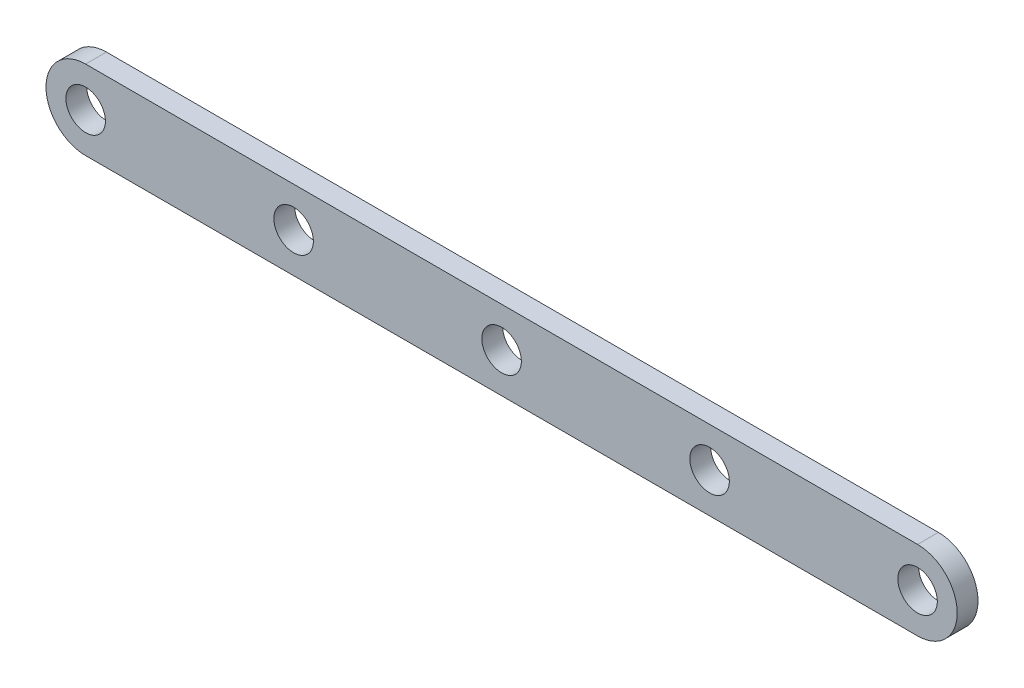
ISO-10303-21;
HEADER;
FILE_DESCRIPTION(('STEP AP214'),'2;1');
FILE_NAME('part.step','',(''),(''),'','','');
FILE_SCHEMA(('AUTOMOTIVE_DESIGN { 1 0 10303 214 1 1 1 1 }'));
ENDSEC;
DATA;
#1=APPLICATION_CONTEXT('core data for automotive mechanical design processes');
#2=APPLICATION_PROTOCOL_DEFINITION('international standard','automotive_design',2000,#1);
#3=PRODUCT_CONTEXT('',#1,'mechanical');
#4=PRODUCT('Part','Part','',(#3));
#5=PRODUCT_RELATED_PRODUCT_CATEGORY('part','',(#4));
#6=PRODUCT_DEFINITION_FORMATION('','',#4);
#7=PRODUCT_DEFINITION_CONTEXT('part definition',#1,'design');
#8=PRODUCT_DEFINITION('design','',#6,#7);
#9=PRODUCT_DEFINITION_SHAPE('','',#8);
#10=(LENGTH_UNIT() NAMED_UNIT(*) SI_UNIT(.MILLI.,.METRE.));
#11=(NAMED_UNIT(*) PLANE_ANGLE_UNIT() SI_UNIT($,.RADIAN.));
#12=(NAMED_UNIT(*) SI_UNIT($,.STERADIAN.) SOLID_ANGLE_UNIT());
#13=UNCERTAINTY_MEASURE_WITH_UNIT(LENGTH_MEASURE(1.E-05),#10,'distance_accuracy_value','');
#14=(GEOMETRIC_REPRESENTATION_CONTEXT(3) GLOBAL_UNCERTAINTY_ASSIGNED_CONTEXT((#13)) GLOBAL_UNIT_ASSIGNED_CONTEXT((#10,
#11,#12)) REPRESENTATION_CONTEXT('',''));
#15=CARTESIAN_POINT('',(0.,0.,0.));
#16=DIRECTION('',(0.,0.,1.));
#17=DIRECTION('',(1.,0.,0.));
#18=AXIS2_PLACEMENT_3D('',#15,#16,#17);
#19=CARTESIAN_POINT('',(50.8,0.,-1.27));
#20=DIRECTION('',(0.,0.,1.));
#21=DIRECTION('',(1.,0.,0.));
#22=AXIS2_PLACEMENT_3D('',#19,#20,#21);
#23=CYLINDRICAL_SURFACE('',#22,2.413);
#24=CARTESIAN_POINT('',(50.8,0.,-1.27));
#25=DIRECTION('',(0.,0.,1.));
#26=DIRECTION('',(1.,0.,0.));
#27=AXIS2_PLACEMENT_3D('',#24,#25,#26);
#28=CIRCLE('',#27,2.413);
#29=CARTESIAN_POINT('',(53.213,0.,-1.27));
#30=VERTEX_POINT('',#29);
#31=EDGE_CURVE('E49',#30,#30,#28,.T.);
#32=ORIENTED_EDGE('',*,*,#31,.F.);
#33=EDGE_LOOP('',(#32));
#34=FACE_BOUND('',#33,.T.);
#35=CARTESIAN_POINT('',(50.8,0.,1.27));
#36=DIRECTION('',(0.,0.,1.));
#37=DIRECTION('',(1.,0.,0.));
#38=AXIS2_PLACEMENT_3D('',#35,#36,#37);
#39=CIRCLE('',#38,2.413);
#40=CARTESIAN_POINT('',(53.213,0.,1.27));
#41=VERTEX_POINT('',#40);
#42=EDGE_CURVE('E11',#41,#41,#39,.T.);
#43=ORIENTED_EDGE('',*,*,#42,.T.);
#44=EDGE_LOOP('',(#43));
#45=FACE_BOUND('',#44,.T.);
#46=ADVANCED_FACE('F41',(#34,#45),#23,.F.);
#47=CARTESIAN_POINT('',(25.4,0.,-1.27));
#48=DIRECTION('',(0.,0.,1.));
#49=DIRECTION('',(1.,0.,0.));
#50=AXIS2_PLACEMENT_3D('',#47,#48,#49);
#51=CYLINDRICAL_SURFACE('',#50,2.413);
#52=CARTESIAN_POINT('',(25.4,0.,-1.27));
#53=DIRECTION('',(0.,0.,1.));
#54=DIRECTION('',(1.,0.,0.));
#55=AXIS2_PLACEMENT_3D('',#52,#53,#54);
#56=CIRCLE('',#55,2.413);
#57=CARTESIAN_POINT('',(27.813,0.,-1.27));
#58=VERTEX_POINT('',#57);
#59=EDGE_CURVE('E119',#58,#58,#56,.T.);
#60=ORIENTED_EDGE('',*,*,#59,.F.);
#61=EDGE_LOOP('',(#60));
#62=FACE_BOUND('',#61,.T.);
#63=CARTESIAN_POINT('',(25.4,0.,1.27));
#64=DIRECTION('',(0.,0.,1.));
#65=DIRECTION('',(1.,0.,0.));
#66=AXIS2_PLACEMENT_3D('',#63,#64,#65);
#67=CIRCLE('',#66,2.413);
#68=CARTESIAN_POINT('',(27.813,0.,1.27));
#69=VERTEX_POINT('',#68);
#70=EDGE_CURVE('E122',#69,#69,#67,.T.);
#71=ORIENTED_EDGE('',*,*,#70,.T.);
#72=EDGE_LOOP('',(#71));
#73=FACE_BOUND('',#72,.T.);
#74=ADVANCED_FACE('F131',(#62,#73),#51,.F.);
#75=CARTESIAN_POINT('',(-25.4,0.,1.27));
#76=DIRECTION('',(0.,0.,-1.));
#77=DIRECTION('',(-1.,0.,0.));
#78=AXIS2_PLACEMENT_3D('',#75,#76,#77);
#79=CYLINDRICAL_SURFACE('',#78,4.84125326370757);
#80=CARTESIAN_POINT('',(-25.4,0.,-1.27));
#81=DIRECTION('',(0.,0.,1.));
#82=DIRECTION('',(1.,0.,0.));
#83=AXIS2_PLACEMENT_3D('',#80,#81,#82);
#84=CIRCLE('',#83,4.84125326370757);
#85=CARTESIAN_POINT('',(-25.4,4.84125326370757,-1.27));
#86=VERTEX_POINT('',#85);
#87=CARTESIAN_POINT('',(-25.4,-4.84125326370757,-1.27));
#88=VERTEX_POINT('',#87);
#89=EDGE_CURVE('E109',#86,#88,#84,.T.);
#90=ORIENTED_EDGE('',*,*,#89,.T.);
#91=DIRECTION('',(0.,0.,-1.));
#92=VECTOR('',#91,1.);
#93=CARTESIAN_POINT('',(-25.4,-4.84125326370757,1.27));
#94=LINE('',#93,#92);
#95=CARTESIAN_POINT('',(-25.4,-4.84125326370757,1.27));
#96=VERTEX_POINT('',#95);
#97=EDGE_CURVE('E100',#96,#88,#94,.T.);
#98=ORIENTED_EDGE('',*,*,#97,.F.);
#99=CARTESIAN_POINT('',(-25.4,0.,1.27));
#100=DIRECTION('',(0.,0.,1.));
#101=DIRECTION('',(1.,0.,0.));
#102=AXIS2_PLACEMENT_3D('',#99,#100,#101);
#103=CIRCLE('',#102,4.84125326370757);
#104=CARTESIAN_POINT('',(-25.4,4.84125326370757,1.27));
#105=VERTEX_POINT('',#104);
#106=EDGE_CURVE('E94',#105,#96,#103,.T.);
#107=ORIENTED_EDGE('',*,*,#106,.F.);
#108=DIRECTION('',(0.,0.,-1.));
#109=VECTOR('',#108,1.);
#110=CARTESIAN_POINT('',(-25.4,4.84125326370757,1.27));
#111=LINE('',#110,#109);
#112=EDGE_CURVE('E105',#105,#86,#111,.T.);
#113=ORIENTED_EDGE('',*,*,#112,.T.);
#114=EDGE_LOOP('',(#90,#98,#107,#113));
#115=FACE_BOUND('',#114,.T.);
#116=ADVANCED_FACE('F156',(#115),#79,.T.);
#117=CARTESIAN_POINT('',(76.2,-4.84125326370757,1.27));
#118=DIRECTION('',(0.,1.,0.));
#119=DIRECTION('',(-1.,0.,0.));
#120=AXIS2_PLACEMENT_3D('',#117,#118,#119);
#121=PLANE('',#120);
#122=DIRECTION('',(1.,0.,0.));
#123=VECTOR('',#122,1.);
#124=CARTESIAN_POINT('',(76.2,-4.84125326370757,-1.27));
#125=LINE('',#124,#123);
#126=CARTESIAN_POINT('',(76.2,-4.84125326370757,-1.27));
#127=VERTEX_POINT('',#126);
#128=EDGE_CURVE('E99',#88,#127,#125,.T.);
#129=ORIENTED_EDGE('',*,*,#128,.T.);
#130=DIRECTION('',(0.,0.,-1.));
#131=VECTOR('',#130,1.);
#132=CARTESIAN_POINT('',(76.2,-4.84125326370757,1.27));
#133=LINE('',#132,#131);
#134=CARTESIAN_POINT('',(76.2,-4.84125326370757,1.27));
#135=VERTEX_POINT('',#134);
#136=EDGE_CURVE('E97',#135,#127,#133,.T.);
#137=ORIENTED_EDGE('',*,*,#136,.F.);
#138=DIRECTION('',(1.,0.,0.));
#139=VECTOR('',#138,1.);
#140=CARTESIAN_POINT('',(76.2,-4.84125326370757,1.27));
#141=LINE('',#140,#139);
#142=EDGE_CURVE('E88',#96,#135,#141,.T.);
#143=ORIENTED_EDGE('',*,*,#142,.F.);
#144=ORIENTED_EDGE('',*,*,#97,.T.);
#145=EDGE_LOOP('',(#129,#137,#143,#144));
#146=FACE_BOUND('',#145,.T.);
#147=ADVANCED_FACE('F98',(#146),#121,.F.);
#148=CARTESIAN_POINT('',(76.2,0.,1.27));
#149=DIRECTION('',(0.,0.,-1.));
#150=DIRECTION('',(-1.,0.,0.));
#151=AXIS2_PLACEMENT_3D('',#148,#149,#150);
#152=CYLINDRICAL_SURFACE('',#151,4.84125326370757);
#153=CARTESIAN_POINT('',(76.2,0.,-1.27));
#154=DIRECTION('',(0.,0.,1.));
#155=DIRECTION('',(1.,0.,0.));
#156=AXIS2_PLACEMENT_3D('',#153,#154,#155);
#157=CIRCLE('',#156,4.84125326370757);
#158=CARTESIAN_POINT('',(76.2,4.84125326370758,-1.27));
#159=VERTEX_POINT('',#158);
#160=EDGE_CURVE('E74',#127,#159,#157,.T.);
#161=ORIENTED_EDGE('',*,*,#160,.T.);
#162=DIRECTION('',(0.,0.,-1.));
#163=VECTOR('',#162,1.);
#164=CARTESIAN_POINT('',(76.2,4.84125326370758,1.27));
#165=LINE('',#164,#163);
#166=CARTESIAN_POINT('',(76.2,4.84125326370758,1.27));
#167=VERTEX_POINT('',#166);
#168=EDGE_CURVE('E101',#167,#159,#165,.T.);
#169=ORIENTED_EDGE('',*,*,#168,.F.);
#170=CARTESIAN_POINT('',(76.2,0.,1.27));
#171=DIRECTION('',(0.,0.,1.));
#172=DIRECTION('',(1.,0.,0.));
#173=AXIS2_PLACEMENT_3D('',#170,#171,#172);
#174=CIRCLE('',#173,4.84125326370757);
#175=EDGE_CURVE('E92',#135,#167,#174,.T.);
#176=ORIENTED_EDGE('',*,*,#175,.F.);
#177=ORIENTED_EDGE('',*,*,#136,.T.);
#178=EDGE_LOOP('',(#161,#169,#176,#177));
#179=FACE_BOUND('',#178,.T.);
#180=ADVANCED_FACE('F103',(#179),#152,.T.);
#181=CARTESIAN_POINT('',(76.2,4.84125326370758,1.27));
#182=DIRECTION('',(0.,-1.,0.));
#183=DIRECTION('',(1.,0.,0.));
#184=AXIS2_PLACEMENT_3D('',#181,#182,#183);
#185=PLANE('',#184);
#186=DIRECTION('',(-1.,0.,0.));
#187=VECTOR('',#186,1.);
#188=CARTESIAN_POINT('',(76.2,4.84125326370758,-1.27));
#189=LINE('',#188,#187);
#190=EDGE_CURVE('E80',#159,#86,#189,.T.);
#191=ORIENTED_EDGE('',*,*,#190,.T.);
#192=ORIENTED_EDGE('',*,*,#112,.F.);
#193=DIRECTION('',(-1.,0.,0.));
#194=VECTOR('',#193,1.);
#195=CARTESIAN_POINT('',(76.2,4.84125326370758,1.27));
#196=LINE('',#195,#194);
#197=EDGE_CURVE('E57',#167,#105,#196,.T.);
#198=ORIENTED_EDGE('',*,*,#197,.F.);
#199=ORIENTED_EDGE('',*,*,#168,.T.);
#200=EDGE_LOOP('',(#191,#192,#198,#199));
#201=FACE_BOUND('',#200,.T.);
#202=ADVANCED_FACE('F135',(#201),#185,.F.);
#203=CARTESIAN_POINT('',(-25.4,0.,1.27));
#204=DIRECTION('',(0.,0.,1.));
#205=DIRECTION('',(1.,0.,0.));
#206=AXIS2_PLACEMENT_3D('',#203,#204,#205);
#207=PLANE('',#206);
#208=CARTESIAN_POINT('',(76.2,0.,1.27));
#209=DIRECTION('',(0.,0.,1.));
#210=DIRECTION('',(1.,0.,0.));
#211=AXIS2_PLACEMENT_3D('',#208,#209,#210);
#212=CIRCLE('',#211,2.413);
#213=CARTESIAN_POINT('',(78.613,0.,1.27));
#214=VERTEX_POINT('',#213);
#215=EDGE_CURVE('E242',#214,#214,#212,.T.);
#216=ORIENTED_EDGE('',*,*,#215,.F.);
#217=EDGE_LOOP('',(#216));
#218=FACE_BOUND('',#217,.T.);
#219=CARTESIAN_POINT('',(0.,0.,1.27));
#220=DIRECTION('',(0.,0.,1.));
#221=DIRECTION('',(1.,0.,0.));
#222=AXIS2_PLACEMENT_3D('',#219,#220,#221);
#223=CIRCLE('',#222,2.413);
#224=CARTESIAN_POINT('',(2.413,0.,1.27));
#225=VERTEX_POINT('',#224);
#226=EDGE_CURVE('E249',#225,#225,#223,.T.);
#227=ORIENTED_EDGE('',*,*,#226,.F.);
#228=EDGE_LOOP('',(#227));
#229=FACE_BOUND('',#228,.T.);
#230=CARTESIAN_POINT('',(-25.4,0.,1.27));
#231=DIRECTION('',(0.,0.,1.));
#232=DIRECTION('',(1.,0.,0.));
#233=AXIS2_PLACEMENT_3D('',#230,#231,#232);
#234=CIRCLE('',#233,2.413);
#235=CARTESIAN_POINT('',(-22.987,0.,1.27));
#236=VERTEX_POINT('',#235);
#237=EDGE_CURVE('E252',#236,#236,#234,.T.);
#238=ORIENTED_EDGE('',*,*,#237,.F.);
#239=EDGE_LOOP('',(#238));
#240=FACE_BOUND('',#239,.T.);
#241=ORIENTED_EDGE('',*,*,#106,.T.);
#242=ORIENTED_EDGE('',*,*,#142,.T.);
#243=ORIENTED_EDGE('',*,*,#175,.T.);
#244=ORIENTED_EDGE('',*,*,#197,.T.);
#245=EDGE_LOOP('',(#241,#242,#243,#244));
#246=FACE_BOUND('',#245,.T.);
#247=ORIENTED_EDGE('',*,*,#70,.F.);
#248=EDGE_LOOP('',(#247));
#249=FACE_BOUND('',#248,.T.);
#250=ORIENTED_EDGE('',*,*,#42,.F.);
#251=EDGE_LOOP('',(#250));
#252=FACE_BOUND('',#251,.T.);
#253=ADVANCED_FACE('F89',(#218,#229,#240,#246,#249,#252),#207,.T.);
#254=CARTESIAN_POINT('',(-25.4,0.,-1.27));
#255=DIRECTION('',(0.,0.,1.));
#256=DIRECTION('',(1.,0.,0.));
#257=AXIS2_PLACEMENT_3D('',#254,#255,#256);
#258=PLANE('',#257);
#259=CARTESIAN_POINT('',(76.2,0.,-1.27));
#260=DIRECTION('',(0.,0.,1.));
#261=DIRECTION('',(1.,0.,0.));
#262=AXIS2_PLACEMENT_3D('',#259,#260,#261);
#263=CIRCLE('',#262,2.413);
#264=CARTESIAN_POINT('',(78.613,0.,-1.27));
#265=VERTEX_POINT('',#264);
#266=EDGE_CURVE('E240',#265,#265,#263,.T.);
#267=ORIENTED_EDGE('',*,*,#266,.T.);
#268=EDGE_LOOP('',(#267));
#269=FACE_BOUND('',#268,.T.);
#270=CARTESIAN_POINT('',(0.,0.,-1.27));
#271=DIRECTION('',(0.,0.,1.));
#272=DIRECTION('',(1.,0.,0.));
#273=AXIS2_PLACEMENT_3D('',#270,#271,#272);
#274=CIRCLE('',#273,2.413);
#275=CARTESIAN_POINT('',(2.413,0.,-1.27));
#276=VERTEX_POINT('',#275);
#277=EDGE_CURVE('E244',#276,#276,#274,.T.);
#278=ORIENTED_EDGE('',*,*,#277,.T.);
#279=EDGE_LOOP('',(#278));
#280=FACE_BOUND('',#279,.T.);
#281=CARTESIAN_POINT('',(-25.4,0.,-1.27));
#282=DIRECTION('',(0.,0.,1.));
#283=DIRECTION('',(1.,0.,0.));
#284=AXIS2_PLACEMENT_3D('',#281,#282,#283);
#285=CIRCLE('',#284,2.413);
#286=CARTESIAN_POINT('',(-22.987,0.,-1.27));
#287=VERTEX_POINT('',#286);
#288=EDGE_CURVE('E112',#287,#287,#285,.T.);
#289=ORIENTED_EDGE('',*,*,#288,.T.);
#290=EDGE_LOOP('',(#289));
#291=FACE_BOUND('',#290,.T.);
#292=ORIENTED_EDGE('',*,*,#89,.F.);
#293=ORIENTED_EDGE('',*,*,#190,.F.);
#294=ORIENTED_EDGE('',*,*,#160,.F.);
#295=ORIENTED_EDGE('',*,*,#128,.F.);
#296=EDGE_LOOP('',(#292,#293,#294,#295));
#297=FACE_BOUND('',#296,.T.);
#298=ORIENTED_EDGE('',*,*,#59,.T.);
#299=EDGE_LOOP('',(#298));
#300=FACE_BOUND('',#299,.T.);
#301=ORIENTED_EDGE('',*,*,#31,.T.);
#302=EDGE_LOOP('',(#301));
#303=FACE_BOUND('',#302,.T.);
#304=ADVANCED_FACE('F127',(#269,#280,#291,#297,#300,#303),#258,.F.);
#305=CARTESIAN_POINT('',(-25.4,0.,-1.27));
#306=DIRECTION('',(0.,0.,1.));
#307=DIRECTION('',(1.,0.,0.));
#308=AXIS2_PLACEMENT_3D('',#305,#306,#307);
#309=CYLINDRICAL_SURFACE('',#308,2.413);
#310=ORIENTED_EDGE('',*,*,#288,.F.);
#311=EDGE_LOOP('',(#310));
#312=FACE_BOUND('',#311,.T.);
#313=ORIENTED_EDGE('',*,*,#237,.T.);
#314=EDGE_LOOP('',(#313));
#315=FACE_BOUND('',#314,.T.);
#316=ADVANCED_FACE('F142',(#312,#315),#309,.F.);
#317=CARTESIAN_POINT('',(0.,0.,-1.27));
#318=DIRECTION('',(0.,0.,1.));
#319=DIRECTION('',(1.,0.,0.));
#320=AXIS2_PLACEMENT_3D('',#317,#318,#319);
#321=CYLINDRICAL_SURFACE('',#320,2.413);
#322=ORIENTED_EDGE('',*,*,#277,.F.);
#323=EDGE_LOOP('',(#322));
#324=FACE_BOUND('',#323,.T.);
#325=ORIENTED_EDGE('',*,*,#226,.T.);
#326=EDGE_LOOP('',(#325));
#327=FACE_BOUND('',#326,.T.);
#328=ADVANCED_FACE('F178',(#324,#327),#321,.F.);
#329=CARTESIAN_POINT('',(76.2,0.,-1.27));
#330=DIRECTION('',(0.,0.,1.));
#331=DIRECTION('',(1.,0.,0.));
#332=AXIS2_PLACEMENT_3D('',#329,#330,#331);
#333=CYLINDRICAL_SURFACE('',#332,2.413);
#334=ORIENTED_EDGE('',*,*,#266,.F.);
#335=EDGE_LOOP('',(#334));
#336=FACE_BOUND('',#335,.T.);
#337=ORIENTED_EDGE('',*,*,#215,.T.);
#338=EDGE_LOOP('',(#337));
#339=FACE_BOUND('',#338,.T.);
#340=ADVANCED_FACE('F220',(#336,#339),#333,.F.);
#341=CLOSED_SHELL('',(#46,#74,#116,#147,#180,#202,#253,#304,#316,#328,#340));
#342=MANIFOLD_SOLID_BREP('B2',#341);
#343=ADVANCED_BREP_SHAPE_REPRESENTATION('',(#18,#342),#14);
#344=SHAPE_DEFINITION_REPRESENTATION(#9,#343);
ENDSEC;
END-ISO-10303-21;
